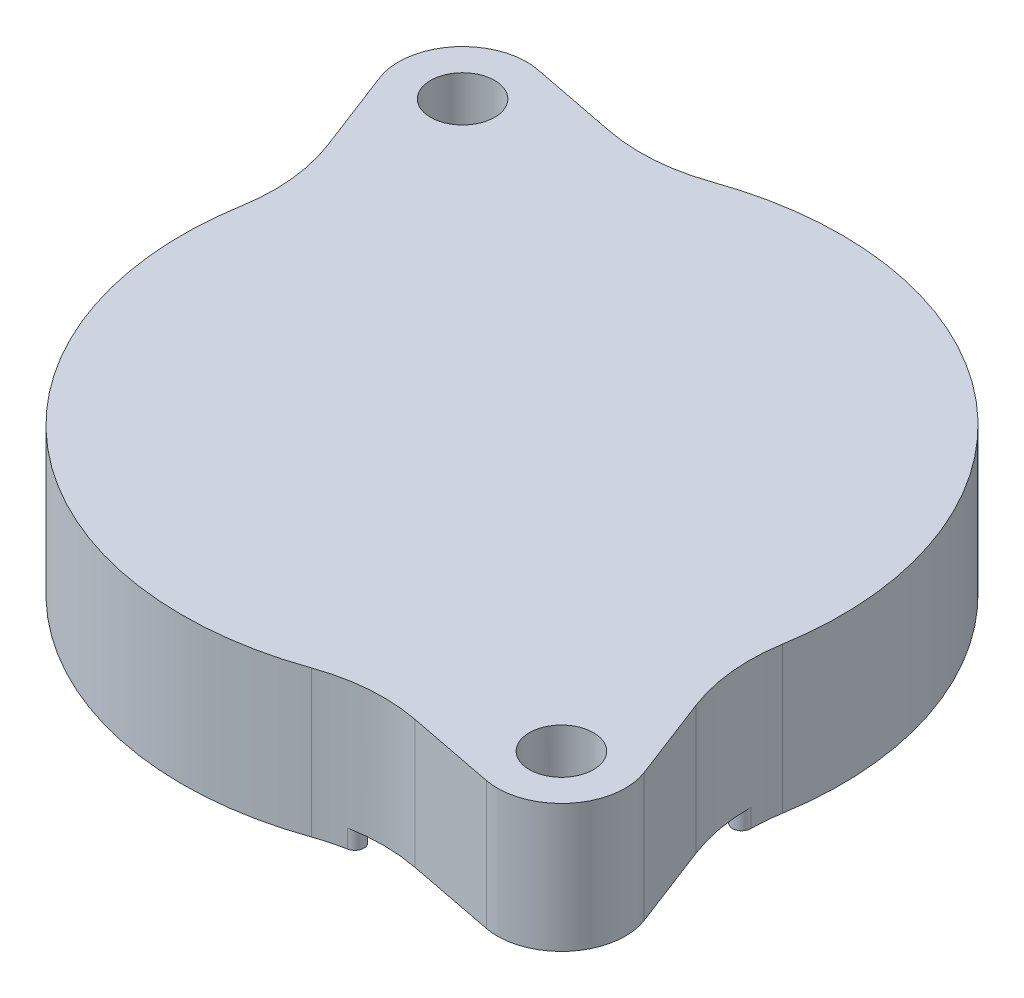
ISO-10303-21;
HEADER;
FILE_DESCRIPTION(('STEP AP214'),'2;1');
FILE_NAME('part.step','',(''),(''),'','','');
FILE_SCHEMA(('AUTOMOTIVE_DESIGN { 1 0 10303 214 1 1 1 1 }'));
ENDSEC;
DATA;
#1=APPLICATION_CONTEXT('core data for automotive mechanical design processes');
#2=APPLICATION_PROTOCOL_DEFINITION('international standard','automotive_design',2000,#1);
#3=PRODUCT_CONTEXT('',#1,'mechanical');
#4=PRODUCT('Part','Part','',(#3));
#5=PRODUCT_RELATED_PRODUCT_CATEGORY('part','',(#4));
#6=PRODUCT_DEFINITION_FORMATION('','',#4);
#7=PRODUCT_DEFINITION_CONTEXT('part definition',#1,'design');
#8=PRODUCT_DEFINITION('design','',#6,#7);
#9=PRODUCT_DEFINITION_SHAPE('','',#8);
#10=(LENGTH_UNIT() NAMED_UNIT(*) SI_UNIT(.MILLI.,.METRE.));
#11=(NAMED_UNIT(*) PLANE_ANGLE_UNIT() SI_UNIT($,.RADIAN.));
#12=(NAMED_UNIT(*) SI_UNIT($,.STERADIAN.) SOLID_ANGLE_UNIT());
#13=UNCERTAINTY_MEASURE_WITH_UNIT(LENGTH_MEASURE(1.E-05),#10,'distance_accuracy_value','');
#14=(GEOMETRIC_REPRESENTATION_CONTEXT(3) GLOBAL_UNCERTAINTY_ASSIGNED_CONTEXT((#13)) GLOBAL_UNIT_ASSIGNED_CONTEXT((#10,
#11,#12)) REPRESENTATION_CONTEXT('',''));
#15=CARTESIAN_POINT('',(0.,0.,0.));
#16=DIRECTION('',(0.,0.,1.));
#17=DIRECTION('',(1.,0.,0.));
#18=AXIS2_PLACEMENT_3D('',#15,#16,#17);
#19=CARTESIAN_POINT('',(9.36197194042168,0.5,26.3885104048477));
#20=DIRECTION('',(0.,1.,0.));
#21=DIRECTION('',(0.,0.,1.));
#22=AXIS2_PLACEMENT_3D('',#19,#20,#21);
#23=PLANE('',#22);
#24=CARTESIAN_POINT('',(-16.7763733043056,0.5,-14.0770486521352));
#25=DIRECTION('',(0.,1.,0.));
#26=DIRECTION('',(0.,0.,1.));
#27=AXIS2_PLACEMENT_3D('',#24,#25,#26);
#28=CIRCLE('',#27,1.75);
#29=CARTESIAN_POINT('',(-16.7763733043056,0.5,-12.3270486521352));
#30=VERTEX_POINT('',#29);
#31=EDGE_CURVE('E603',#30,#30,#28,.T.);
#32=ORIENTED_EDGE('',*,*,#31,.T.);
#33=EDGE_LOOP('',(#32));
#34=FACE_BOUND('',#33,.T.);
#35=CARTESIAN_POINT('',(16.7763733043056,0.5,14.0770486521352));
#36=DIRECTION('',(0.,1.,0.));
#37=DIRECTION('',(0.,0.,1.));
#38=AXIS2_PLACEMENT_3D('',#35,#36,#37);
#39=CIRCLE('',#38,1.75);
#40=CARTESIAN_POINT('',(16.7763733043056,0.5,15.8270486521352));
#41=VERTEX_POINT('',#40);
#42=EDGE_CURVE('E460',#41,#41,#39,.T.);
#43=ORIENTED_EDGE('',*,*,#42,.T.);
#44=EDGE_LOOP('',(#43));
#45=FACE_BOUND('',#44,.T.);
#46=CARTESIAN_POINT('',(-17.1135194082719,0.5,-4.56939315363405));
#47=DIRECTION('',(0.,-1.,0.));
#48=DIRECTION('',(0.,0.,1.));
#49=AXIS2_PLACEMENT_3D('',#46,#47,#48);
#50=CIRCLE('',#49,0.500000000000006);
#51=CARTESIAN_POINT('',(-17.6135089128285,0.5,-4.57263280380687));
#52=VERTEX_POINT('',#51);
#53=CARTESIAN_POINT('',(-16.7921256034286,0.5,-4.95241537519354));
#54=VERTEX_POINT('',#53);
#55=EDGE_CURVE('E458',#52,#54,#50,.T.);
#56=ORIENTED_EDGE('',*,*,#55,.F.);
#57=CARTESIAN_POINT('',(-27.6132990039605,0.5,-4.63742580726334));
#58=DIRECTION('',(0.,1.,0.));
#59=DIRECTION('',(0.,0.,1.));
#60=AXIS2_PLACEMENT_3D('',#57,#58,#59);
#61=CIRCLE('',#60,9.99999999999999);
#62=CARTESIAN_POINT('',(-18.2774947389885,0.5,-8.2211053027163));
#63=VERTEX_POINT('',#62);
#64=EDGE_CURVE('E243',#52,#63,#61,.T.);
#65=ORIENTED_EDGE('',*,*,#64,.T.);
#66=DIRECTION('',(-0.358367949545296,0.,-0.933580426497204));
#67=VECTOR('',#66,1.);
#68=CARTESIAN_POINT('',(-18.2774947389885,0.5,-8.2211053027163));
#69=LINE('',#68,#67);
#70=CARTESIAN_POINT('',(-20.0439047970459,0.5,-12.8227608287267));
#71=VERTEX_POINT('',#70);
#72=EDGE_CURVE('E369',#63,#71,#69,.T.);
#73=ORIENTED_EDGE('',*,*,#72,.T.);
#74=CARTESIAN_POINT('',(-16.7763733043056,0.5,-14.0770486521352));
#75=DIRECTION('',(0.,-1.,0.));
#76=DIRECTION('',(0.,0.,-1.));
#77=AXIS2_PLACEMENT_3D('',#74,#75,#76);
#78=CIRCLE('',#77,3.5);
#79=CARTESIAN_POINT('',(-16.1085418204878,0.5,-17.512743794202));
#80=VERTEX_POINT('',#79);
#81=EDGE_CURVE('E372',#71,#80,#78,.T.);
#82=ORIENTED_EDGE('',*,*,#81,.T.);
#83=DIRECTION('',(0.981627183447665,0.,0.190808995376539));
#84=VECTOR('',#83,1.);
#85=CARTESIAN_POINT('',(-16.1085418204878,0.5,-17.512743794202));
#86=LINE('',#85,#84);
#87=CARTESIAN_POINT('',(-11.2700618941871,0.5,-16.5722385703711));
#88=VERTEX_POINT('',#87);
#89=EDGE_CURVE('E375',#80,#88,#86,.T.);
#90=ORIENTED_EDGE('',*,*,#89,.T.);
#91=CARTESIAN_POINT('',(-9.36197194042165,0.5,-26.3885104048478));
#92=DIRECTION('',(0.,1.,0.));
#93=DIRECTION('',(0.,0.,1.));
#94=AXIS2_PLACEMENT_3D('',#91,#92,#93);
#95=CIRCLE('',#94,10.);
#96=CARTESIAN_POINT('',(-7.56171796189986,0.5,-16.551890781582));
#97=VERTEX_POINT('',#96);
#98=EDGE_CURVE('E378',#88,#97,#95,.T.);
#99=ORIENTED_EDGE('',*,*,#98,.T.);
#100=CARTESIAN_POINT('',(-7.47170526297377,0.5,-16.0600598004187));
#101=DIRECTION('',(0.,-1.,0.));
#102=DIRECTION('',(0.,0.,1.));
#103=AXIS2_PLACEMENT_3D('',#100,#101,#102);
#104=CIRCLE('',#103,0.500000000000007);
#105=CARTESIAN_POINT('',(-7.79309906781705,0.5,-15.6770375788592));
#106=VERTEX_POINT('',#105);
#107=EDGE_CURVE('E257',#106,#97,#104,.T.);
#108=ORIENTED_EDGE('',*,*,#107,.F.);
#109=DIRECTION('',(-0.766044443118979,0.,-0.642787609686538));
#110=VECTOR('',#109,1.);
#111=CARTESIAN_POINT('',(-7.79309906781705,0.5,-15.6770375788592));
#112=LINE('',#111,#110);
#113=CARTESIAN_POINT('',(-7.40043419447198,0.5,-15.3475526284591));
#114=VERTEX_POINT('',#113);
#115=EDGE_CURVE('E288',#114,#106,#112,.T.);
#116=ORIENTED_EDGE('',*,*,#115,.F.);
#117=CARTESIAN_POINT('',(-7.07904038962871,0.5,-15.7305748500186));
#118=DIRECTION('',(0.,-1.,0.));
#119=DIRECTION('',(0.,0.,1.));
#120=AXIS2_PLACEMENT_3D('',#117,#118,#119);
#121=CIRCLE('',#120,0.500000000000004);
#122=CARTESIAN_POINT('',(-6.87385126062866,0.5,-15.2746171531429));
#123=VERTEX_POINT('',#122);
#124=EDGE_CURVE('E285',#123,#114,#121,.T.);
#125=ORIENTED_EDGE('',*,*,#124,.F.);
#126=CARTESIAN_POINT('',(0.,0.5,0.));
#127=DIRECTION('',(0.,1.,0.));
#128=DIRECTION('',(0.,0.,-1.));
#129=AXIS2_PLACEMENT_3D('',#126,#127,#128);
#130=CIRCLE('',#129,16.750037621699);
#131=CARTESIAN_POINT('',(16.2361931416701,0.5,4.11701258131654));
#132=VERTEX_POINT('',#131);
#133=EDGE_CURVE('E282',#132,#123,#130,.T.);
#134=ORIENTED_EDGE('',*,*,#133,.F.);
#135=CARTESIAN_POINT('',(16.7208545349268,0.5,4.23990820323392));
#136=DIRECTION('',(0.,-1.,0.));
#137=DIRECTION('',(0.,0.,1.));
#138=AXIS2_PLACEMENT_3D('',#135,#136,#137);
#139=CIRCLE('',#138,0.500000000000004);
#140=CARTESIAN_POINT('',(16.3994607300835,0.5,4.62293042479341));
#141=VERTEX_POINT('',#140);
#142=EDGE_CURVE('E279',#141,#132,#139,.T.);
#143=ORIENTED_EDGE('',*,*,#142,.F.);
#144=DIRECTION('',(-0.766044443118984,0.,-0.642787609686532));
#145=VECTOR('',#144,1.);
#146=CARTESIAN_POINT('',(16.3994607300835,0.5,4.62293042479341));
#147=LINE('',#146,#145);
#148=CARTESIAN_POINT('',(16.7921256034286,0.5,4.95241537519352));
#149=VERTEX_POINT('',#148);
#150=EDGE_CURVE('E247',#149,#141,#147,.T.);
#151=ORIENTED_EDGE('',*,*,#150,.F.);
#152=CARTESIAN_POINT('',(17.1135194082719,0.5,4.56939315363402));
#153=DIRECTION('',(0.,-1.,0.));
#154=DIRECTION('',(0.,0.,1.));
#155=AXIS2_PLACEMENT_3D('',#152,#153,#154);
#156=CIRCLE('',#155,0.500000000000004);
#157=CARTESIAN_POINT('',(17.6135089128285,0.5,4.57263280380685));
#158=VERTEX_POINT('',#157);
#159=EDGE_CURVE('E244',#158,#149,#156,.T.);
#160=ORIENTED_EDGE('',*,*,#159,.F.);
#161=CARTESIAN_POINT('',(27.6132990039605,0.5,4.63742580726333));
#162=DIRECTION('',(0.,1.,0.));
#163=DIRECTION('',(0.,0.,1.));
#164=AXIS2_PLACEMENT_3D('',#161,#162,#163);
#165=CIRCLE('',#164,10.);
#166=CARTESIAN_POINT('',(18.2774947389885,0.5,8.22110530271631));
#167=VERTEX_POINT('',#166);
#168=EDGE_CURVE('E386',#158,#167,#165,.T.);
#169=ORIENTED_EDGE('',*,*,#168,.T.);
#170=DIRECTION('',(0.358367949545295,0.,0.933580426497204));
#171=VECTOR('',#170,1.);
#172=CARTESIAN_POINT('',(18.2774947389885,0.5,8.22110530271631));
#173=LINE('',#172,#171);
#174=CARTESIAN_POINT('',(20.0439047970458,0.5,12.8227608287267));
#175=VERTEX_POINT('',#174);
#176=EDGE_CURVE('E388',#167,#175,#173,.T.);
#177=ORIENTED_EDGE('',*,*,#176,.T.);
#178=CARTESIAN_POINT('',(16.7763733043056,0.5,14.0770486521352));
#179=DIRECTION('',(0.,-1.,0.));
#180=DIRECTION('',(0.,0.,-1.));
#181=AXIS2_PLACEMENT_3D('',#178,#179,#180);
#182=CIRCLE('',#181,3.49999999999999);
#183=CARTESIAN_POINT('',(16.1085418204877,0.5,17.512743794202));
#184=VERTEX_POINT('',#183);
#185=EDGE_CURVE('E512',#175,#184,#182,.T.);
#186=ORIENTED_EDGE('',*,*,#185,.T.);
#187=DIRECTION('',(-0.981627183447665,0.,-0.19080899537654));
#188=VECTOR('',#187,1.);
#189=CARTESIAN_POINT('',(16.1085418204877,0.5,17.512743794202));
#190=LINE('',#189,#188);
#191=CARTESIAN_POINT('',(11.2700618941871,0.5,16.5722385703711));
#192=VERTEX_POINT('',#191);
#193=EDGE_CURVE('E332',#184,#192,#190,.T.);
#194=ORIENTED_EDGE('',*,*,#193,.T.);
#195=CARTESIAN_POINT('',(9.36197194042168,0.5,26.3885104048477));
#196=DIRECTION('',(0.,1.,0.));
#197=DIRECTION('',(0.,0.,1.));
#198=AXIS2_PLACEMENT_3D('',#195,#196,#197);
#199=CIRCLE('',#198,9.99999999999999);
#200=CARTESIAN_POINT('',(7.56171796189986,0.5,16.551890781582));
#201=VERTEX_POINT('',#200);
#202=EDGE_CURVE('E366',#192,#201,#199,.T.);
#203=ORIENTED_EDGE('',*,*,#202,.T.);
#204=CARTESIAN_POINT('',(7.47170526297377,0.5,16.0600598004187));
#205=DIRECTION('',(0.,-1.,0.));
#206=DIRECTION('',(0.,0.,1.));
#207=AXIS2_PLACEMENT_3D('',#204,#205,#206);
#208=CIRCLE('',#207,0.500000000000005);
#209=CARTESIAN_POINT('',(7.79309906781704,0.5,15.6770375788592));
#210=VERTEX_POINT('',#209);
#211=EDGE_CURVE('E238',#210,#201,#208,.T.);
#212=ORIENTED_EDGE('',*,*,#211,.F.);
#213=DIRECTION('',(0.766044443118974,0.,0.642787609686544));
#214=VECTOR('',#213,1.);
#215=CARTESIAN_POINT('',(7.79309906781704,0.5,15.6770375788592));
#216=LINE('',#215,#214);
#217=CARTESIAN_POINT('',(7.40043419447198,0.5,15.3475526284591));
#218=VERTEX_POINT('',#217);
#219=EDGE_CURVE('E469',#218,#210,#216,.T.);
#220=ORIENTED_EDGE('',*,*,#219,.F.);
#221=CARTESIAN_POINT('',(7.07904038962871,0.5,15.7305748500186));
#222=DIRECTION('',(0.,-1.,0.));
#223=DIRECTION('',(0.,0.,1.));
#224=AXIS2_PLACEMENT_3D('',#221,#222,#223);
#225=CIRCLE('',#224,0.500000000000004);
#226=CARTESIAN_POINT('',(6.87385126062867,0.5,15.2746171531429));
#227=VERTEX_POINT('',#226);
#228=EDGE_CURVE('E466',#227,#218,#225,.T.);
#229=ORIENTED_EDGE('',*,*,#228,.F.);
#230=CARTESIAN_POINT('',(0.,0.5,0.));
#231=DIRECTION('',(0.,1.,0.));
#232=DIRECTION('',(0.,0.,-1.));
#233=AXIS2_PLACEMENT_3D('',#230,#231,#232);
#234=CIRCLE('',#233,16.750037621699);
#235=CARTESIAN_POINT('',(-16.2361931416701,0.5,-4.11701258131654));
#236=VERTEX_POINT('',#235);
#237=EDGE_CURVE('E463',#236,#227,#234,.T.);
#238=ORIENTED_EDGE('',*,*,#237,.F.);
#239=CARTESIAN_POINT('',(-16.7208545349268,0.5,-4.23990820323392));
#240=DIRECTION('',(0.,-1.,0.));
#241=DIRECTION('',(0.,0.,1.));
#242=AXIS2_PLACEMENT_3D('',#239,#240,#241);
#243=CIRCLE('',#242,0.500000000000007);
#244=CARTESIAN_POINT('',(-16.3994607300835,0.5,-4.62293042479342));
#245=VERTEX_POINT('',#244);
#246=EDGE_CURVE('E57',#245,#236,#243,.T.);
#247=ORIENTED_EDGE('',*,*,#246,.F.);
#248=DIRECTION('',(0.766044443118981,0.,0.642787609686535));
#249=VECTOR('',#248,1.);
#250=CARTESIAN_POINT('',(-16.3994607300835,0.5,-4.62293042479342));
#251=LINE('',#250,#249);
#252=EDGE_CURVE('E52',#54,#245,#251,.T.);
#253=ORIENTED_EDGE('',*,*,#252,.F.);
#254=EDGE_LOOP('',(#56,#65,#73,#82,#90,#99,#108,#116,#125,#134,#143,#151,#160,#169,#177,#186,
#194,#203,#212,#220,#229,#238,#247,#253));
#255=FACE_BOUND('',#254,.T.);
#256=ADVANCED_FACE('F35',(#34,#45,#255),#23,.F.);
#257=CARTESIAN_POINT('',(9.36197194042168,7.5,26.3885104048477));
#258=DIRECTION('',(0.,-1.,0.));
#259=DIRECTION('',(0.,0.,-1.));
#260=AXIS2_PLACEMENT_3D('',#257,#258,#259);
#261=CYLINDRICAL_SURFACE('',#260,9.99999999999999);
#262=ORIENTED_EDGE('',*,*,#202,.F.);
#263=DIRECTION('',(0.,-1.,0.));
#264=VECTOR('',#263,1.);
#265=CARTESIAN_POINT('',(11.2700618941871,7.5,16.5722385703711));
#266=LINE('',#265,#264);
#267=CARTESIAN_POINT('',(11.2700618941871,7.5,16.5722385703711));
#268=VERTEX_POINT('',#267);
#269=EDGE_CURVE('E11',#268,#192,#266,.T.);
#270=ORIENTED_EDGE('',*,*,#269,.F.);
#271=CARTESIAN_POINT('',(9.36197194042168,7.5,26.3885104048477));
#272=DIRECTION('',(0.,1.,0.));
#273=DIRECTION('',(0.,0.,1.));
#274=AXIS2_PLACEMENT_3D('',#271,#272,#273);
#275=CIRCLE('',#274,9.99999999999999);
#276=CARTESIAN_POINT('',(6.01841053312822,7.5,16.9640424031164));
#277=VERTEX_POINT('',#276);
#278=EDGE_CURVE('E328',#268,#277,#275,.T.);
#279=ORIENTED_EDGE('',*,*,#278,.T.);
#280=DIRECTION('',(0.,-1.,0.));
#281=VECTOR('',#280,1.);
#282=CARTESIAN_POINT('',(6.01841053312822,7.5,16.9640424031164));
#283=LINE('',#282,#281);
#284=CARTESIAN_POINT('',(6.01841053312823,-0.5,16.9640424031164));
#285=VERTEX_POINT('',#284);
#286=EDGE_CURVE('E365',#277,#285,#283,.T.);
#287=ORIENTED_EDGE('',*,*,#286,.T.);
#288=CARTESIAN_POINT('',(9.36197194042168,-0.5,26.3885104048477));
#289=DIRECTION('',(0.,1.,0.));
#290=DIRECTION('',(0.,0.,-1.));
#291=AXIS2_PLACEMENT_3D('',#288,#289,#290);
#292=CIRCLE('',#291,9.99999999999999);
#293=CARTESIAN_POINT('',(7.56171796189986,-0.5,16.551890781582));
#294=VERTEX_POINT('',#293);
#295=EDGE_CURVE('E444',#294,#285,#292,.T.);
#296=ORIENTED_EDGE('',*,*,#295,.F.);
#297=DIRECTION('',(0.,1.,0.));
#298=VECTOR('',#297,1.);
#299=CARTESIAN_POINT('',(7.56171796189986,-0.5,16.551890781582));
#300=LINE('',#299,#298);
#301=EDGE_CURVE('E452',#294,#201,#300,.T.);
#302=ORIENTED_EDGE('',*,*,#301,.T.);
#303=EDGE_LOOP('',(#262,#270,#279,#287,#296,#302));
#304=FACE_BOUND('',#303,.T.);
#305=ADVANCED_FACE('F37',(#304),#261,.F.);
#306=CARTESIAN_POINT('',(16.1085418204877,7.5,17.512743794202));
#307=DIRECTION('',(-0.19080899537654,0.,0.981627183447665));
#308=DIRECTION('',(0.981627183447665,0.,0.19080899537654));
#309=AXIS2_PLACEMENT_3D('',#306,#307,#308);
#310=PLANE('',#309);
#311=ORIENTED_EDGE('',*,*,#193,.F.);
#312=DIRECTION('',(0.,-1.,0.));
#313=VECTOR('',#312,1.);
#314=CARTESIAN_POINT('',(16.1085418204877,7.5,17.512743794202));
#315=LINE('',#314,#313);
#316=CARTESIAN_POINT('',(16.1085418204877,7.5,17.512743794202));
#317=VERTEX_POINT('',#316);
#318=EDGE_CURVE('E44',#317,#184,#315,.T.);
#319=ORIENTED_EDGE('',*,*,#318,.F.);
#320=DIRECTION('',(-0.981627183447665,0.,-0.19080899537654));
#321=VECTOR('',#320,1.);
#322=CARTESIAN_POINT('',(16.1085418204877,7.5,17.512743794202));
#323=LINE('',#322,#321);
#324=EDGE_CURVE('E362',#317,#268,#323,.T.);
#325=ORIENTED_EDGE('',*,*,#324,.T.);
#326=ORIENTED_EDGE('',*,*,#269,.T.);
#327=EDGE_LOOP('',(#311,#319,#325,#326));
#328=FACE_BOUND('',#327,.T.);
#329=ADVANCED_FACE('F524',(#328),#310,.T.);
#330=CARTESIAN_POINT('',(16.7763733043056,7.5,14.0770486521352));
#331=DIRECTION('',(0.,-1.,0.));
#332=DIRECTION('',(0.,0.,-1.));
#333=AXIS2_PLACEMENT_3D('',#330,#331,#332);
#334=CYLINDRICAL_SURFACE('',#333,3.49999999999999);
#335=ORIENTED_EDGE('',*,*,#185,.F.);
#336=DIRECTION('',(0.,-1.,0.));
#337=VECTOR('',#336,1.);
#338=CARTESIAN_POINT('',(20.0439047970458,7.5,12.8227608287267));
#339=LINE('',#338,#337);
#340=CARTESIAN_POINT('',(20.0439047970458,7.5,12.8227608287267));
#341=VERTEX_POINT('',#340);
#342=EDGE_CURVE('E426',#341,#175,#339,.T.);
#343=ORIENTED_EDGE('',*,*,#342,.F.);
#344=CARTESIAN_POINT('',(16.7763733043056,7.5,14.0770486521352));
#345=DIRECTION('',(0.,-1.,0.));
#346=DIRECTION('',(0.,0.,-1.));
#347=AXIS2_PLACEMENT_3D('',#344,#345,#346);
#348=CIRCLE('',#347,3.49999999999999);
#349=EDGE_CURVE('E359',#341,#317,#348,.T.);
#350=ORIENTED_EDGE('',*,*,#349,.T.);
#351=ORIENTED_EDGE('',*,*,#318,.T.);
#352=EDGE_LOOP('',(#335,#343,#350,#351));
#353=FACE_BOUND('',#352,.T.);
#354=ADVANCED_FACE('F522',(#353),#334,.T.);
#355=CARTESIAN_POINT('',(18.2774947389885,7.5,8.22110530271631));
#356=DIRECTION('',(0.933580426497204,0.,-0.358367949545295));
#357=DIRECTION('',(-0.358367949545295,0.,-0.933580426497204));
#358=AXIS2_PLACEMENT_3D('',#355,#356,#357);
#359=PLANE('',#358);
#360=ORIENTED_EDGE('',*,*,#176,.F.);
#361=DIRECTION('',(0.,-1.,0.));
#362=VECTOR('',#361,1.);
#363=CARTESIAN_POINT('',(18.2774947389885,7.5,8.22110530271631));
#364=LINE('',#363,#362);
#365=CARTESIAN_POINT('',(18.2774947389885,7.5,8.22110530271631));
#366=VERTEX_POINT('',#365);
#367=EDGE_CURVE('E402',#366,#167,#364,.T.);
#368=ORIENTED_EDGE('',*,*,#367,.F.);
#369=DIRECTION('',(0.358367949545295,0.,0.933580426497204));
#370=VECTOR('',#369,1.);
#371=CARTESIAN_POINT('',(18.2774947389885,7.5,8.22110530271631));
#372=LINE('',#371,#370);
#373=EDGE_CURVE('E356',#366,#341,#372,.T.);
#374=ORIENTED_EDGE('',*,*,#373,.T.);
#375=ORIENTED_EDGE('',*,*,#342,.T.);
#376=EDGE_LOOP('',(#360,#368,#374,#375));
#377=FACE_BOUND('',#376,.T.);
#378=ADVANCED_FACE('F518',(#377),#359,.T.);
#379=CARTESIAN_POINT('',(27.6132990039605,7.5,4.63742580726333));
#380=DIRECTION('',(0.,-1.,0.));
#381=DIRECTION('',(0.,0.,-1.));
#382=AXIS2_PLACEMENT_3D('',#379,#380,#381);
#383=CYLINDRICAL_SURFACE('',#382,10.);
#384=ORIENTED_EDGE('',*,*,#168,.F.);
#385=DIRECTION('',(0.,1.,0.));
#386=VECTOR('',#385,1.);
#387=CARTESIAN_POINT('',(17.6135089128285,-0.5,4.57263280380685));
#388=LINE('',#387,#386);
#389=CARTESIAN_POINT('',(17.6135089128285,-0.5,4.57263280380685));
#390=VERTEX_POINT('',#389);
#391=EDGE_CURVE('E327',#390,#158,#388,.T.);
#392=ORIENTED_EDGE('',*,*,#391,.F.);
#393=CARTESIAN_POINT('',(27.6132990039605,-0.5,4.63742580726333));
#394=DIRECTION('',(0.,1.,0.));
#395=DIRECTION('',(0.,0.,-1.));
#396=AXIS2_PLACEMENT_3D('',#393,#394,#395);
#397=CIRCLE('',#396,10.);
#398=CARTESIAN_POINT('',(17.7514065025461,-0.5,2.98120230466929));
#399=VERTEX_POINT('',#398);
#400=EDGE_CURVE('E260',#399,#390,#397,.T.);
#401=ORIENTED_EDGE('',*,*,#400,.F.);
#402=DIRECTION('',(0.,-1.,0.));
#403=VECTOR('',#402,1.);
#404=CARTESIAN_POINT('',(17.7514065025461,7.5,2.98120230466927));
#405=LINE('',#404,#403);
#406=CARTESIAN_POINT('',(17.7514065025461,7.5,2.98120230466927));
#407=VERTEX_POINT('',#406);
#408=EDGE_CURVE('E423',#407,#399,#405,.T.);
#409=ORIENTED_EDGE('',*,*,#408,.F.);
#410=CARTESIAN_POINT('',(27.6132990039605,7.5,4.63742580726333));
#411=DIRECTION('',(0.,1.,0.));
#412=DIRECTION('',(0.,0.,1.));
#413=AXIS2_PLACEMENT_3D('',#410,#411,#412);
#414=CIRCLE('',#413,10.);
#415=EDGE_CURVE('E353',#407,#366,#414,.T.);
#416=ORIENTED_EDGE('',*,*,#415,.T.);
#417=ORIENTED_EDGE('',*,*,#367,.T.);
#418=EDGE_LOOP('',(#384,#392,#401,#409,#416,#417));
#419=FACE_BOUND('',#418,.T.);
#420=ADVANCED_FACE('F400',(#419),#383,.F.);
#421=CARTESIAN_POINT('',(0.,7.5,0.));
#422=DIRECTION('',(0.,-1.,0.));
#423=DIRECTION('',(0.,0.,-1.));
#424=AXIS2_PLACEMENT_3D('',#421,#422,#423);
#425=CYLINDRICAL_SURFACE('',#424,18.);
#426=ORIENTED_EDGE('',*,*,#408,.T.);
#427=CARTESIAN_POINT('',(0.,-0.5,0.));
#428=DIRECTION('',(0.,-1.,0.));
#429=DIRECTION('',(0.,0.,1.));
#430=AXIS2_PLACEMENT_3D('',#427,#428,#429);
#431=CIRCLE('',#430,18.);
#432=CARTESIAN_POINT('',(-6.0184105331282,-0.5,-16.9640424031164));
#433=VERTEX_POINT('',#432);
#434=EDGE_CURVE('E256',#433,#399,#431,.T.);
#435=ORIENTED_EDGE('',*,*,#434,.F.);
#436=DIRECTION('',(0.,-1.,0.));
#437=VECTOR('',#436,1.);
#438=CARTESIAN_POINT('',(-6.01841053312822,7.5,-16.9640424031164));
#439=LINE('',#438,#437);
#440=CARTESIAN_POINT('',(-6.01841053312822,7.5,-16.9640424031164));
#441=VERTEX_POINT('',#440);
#442=EDGE_CURVE('E421',#441,#433,#439,.T.);
#443=ORIENTED_EDGE('',*,*,#442,.F.);
#444=CARTESIAN_POINT('',(0.,7.5,0.));
#445=DIRECTION('',(0.,-1.,0.));
#446=DIRECTION('',(0.,0.,-1.));
#447=AXIS2_PLACEMENT_3D('',#444,#445,#446);
#448=CIRCLE('',#447,18.);
#449=EDGE_CURVE('E350',#441,#407,#448,.T.);
#450=ORIENTED_EDGE('',*,*,#449,.T.);
#451=EDGE_LOOP('',(#426,#435,#443,#450));
#452=FACE_BOUND('',#451,.T.);
#453=ADVANCED_FACE('F420',(#452),#425,.T.);
#454=CARTESIAN_POINT('',(-9.36197194042165,7.5,-26.3885104048478));
#455=DIRECTION('',(0.,-1.,0.));
#456=DIRECTION('',(0.,0.,-1.));
#457=AXIS2_PLACEMENT_3D('',#454,#455,#456);
#458=CYLINDRICAL_SURFACE('',#457,10.);
#459=ORIENTED_EDGE('',*,*,#98,.F.);
#460=DIRECTION('',(0.,-1.,0.));
#461=VECTOR('',#460,1.);
#462=CARTESIAN_POINT('',(-11.2700618941871,7.5,-16.5722385703711));
#463=LINE('',#462,#461);
#464=CARTESIAN_POINT('',(-11.2700618941871,7.5,-16.5722385703711));
#465=VERTEX_POINT('',#464);
#466=EDGE_CURVE('E428',#465,#88,#463,.T.);
#467=ORIENTED_EDGE('',*,*,#466,.F.);
#468=CARTESIAN_POINT('',(-9.36197194042165,7.5,-26.3885104048478));
#469=DIRECTION('',(0.,1.,0.));
#470=DIRECTION('',(0.,0.,1.));
#471=AXIS2_PLACEMENT_3D('',#468,#469,#470);
#472=CIRCLE('',#471,10.);
#473=EDGE_CURVE('E347',#465,#441,#472,.T.);
#474=ORIENTED_EDGE('',*,*,#473,.T.);
#475=ORIENTED_EDGE('',*,*,#442,.T.);
#476=CARTESIAN_POINT('',(-9.36197194042165,-0.5,-26.3885104048478));
#477=DIRECTION('',(0.,1.,0.));
#478=DIRECTION('',(0.,0.,-1.));
#479=AXIS2_PLACEMENT_3D('',#476,#477,#478);
#480=CIRCLE('',#479,10.);
#481=CARTESIAN_POINT('',(-7.56171796189987,-0.5,-16.551890781582));
#482=VERTEX_POINT('',#481);
#483=EDGE_CURVE('E253',#482,#433,#480,.T.);
#484=ORIENTED_EDGE('',*,*,#483,.F.);
#485=DIRECTION('',(0.,1.,0.));
#486=VECTOR('',#485,1.);
#487=CARTESIAN_POINT('',(-7.56171796189987,-0.5,-16.551890781582));
#488=LINE('',#487,#486);
#489=EDGE_CURVE('E276',#482,#97,#488,.T.);
#490=ORIENTED_EDGE('',*,*,#489,.T.);
#491=EDGE_LOOP('',(#459,#467,#474,#475,#484,#490));
#492=FACE_BOUND('',#491,.T.);
#493=ADVANCED_FACE('F541',(#492),#458,.F.);
#494=CARTESIAN_POINT('',(-16.1085418204878,7.5,-17.512743794202));
#495=DIRECTION('',(0.190808995376539,0.,-0.981627183447665));
#496=DIRECTION('',(-0.981627183447665,0.,-0.190808995376539));
#497=AXIS2_PLACEMENT_3D('',#494,#495,#496);
#498=PLANE('',#497);
#499=ORIENTED_EDGE('',*,*,#89,.F.);
#500=DIRECTION('',(0.,-1.,0.));
#501=VECTOR('',#500,1.);
#502=CARTESIAN_POINT('',(-16.1085418204878,7.5,-17.512743794202));
#503=LINE('',#502,#501);
#504=CARTESIAN_POINT('',(-16.1085418204878,7.5,-17.512743794202));
#505=VERTEX_POINT('',#504);
#506=EDGE_CURVE('E433',#505,#80,#503,.T.);
#507=ORIENTED_EDGE('',*,*,#506,.F.);
#508=DIRECTION('',(0.981627183447665,0.,0.190808995376539));
#509=VECTOR('',#508,1.);
#510=CARTESIAN_POINT('',(-16.1085418204878,7.5,-17.512743794202));
#511=LINE('',#510,#509);
#512=EDGE_CURVE('E344',#505,#465,#511,.T.);
#513=ORIENTED_EDGE('',*,*,#512,.T.);
#514=ORIENTED_EDGE('',*,*,#466,.T.);
#515=EDGE_LOOP('',(#499,#507,#513,#514));
#516=FACE_BOUND('',#515,.T.);
#517=ADVANCED_FACE('F539',(#516),#498,.T.);
#518=CARTESIAN_POINT('',(-16.7763733043056,7.5,-14.0770486521352));
#519=DIRECTION('',(0.,-1.,0.));
#520=DIRECTION('',(0.,0.,-1.));
#521=AXIS2_PLACEMENT_3D('',#518,#519,#520);
#522=CYLINDRICAL_SURFACE('',#521,3.5);
#523=ORIENTED_EDGE('',*,*,#81,.F.);
#524=DIRECTION('',(0.,-1.,0.));
#525=VECTOR('',#524,1.);
#526=CARTESIAN_POINT('',(-20.0439047970459,7.5,-12.8227608287267));
#527=LINE('',#526,#525);
#528=CARTESIAN_POINT('',(-20.0439047970459,7.5,-12.8227608287267));
#529=VERTEX_POINT('',#528);
#530=EDGE_CURVE('E435',#529,#71,#527,.T.);
#531=ORIENTED_EDGE('',*,*,#530,.F.);
#532=CARTESIAN_POINT('',(-16.7763733043056,7.5,-14.0770486521352));
#533=DIRECTION('',(0.,-1.,0.));
#534=DIRECTION('',(0.,0.,-1.));
#535=AXIS2_PLACEMENT_3D('',#532,#533,#534);
#536=CIRCLE('',#535,3.5);
#537=EDGE_CURVE('E341',#529,#505,#536,.T.);
#538=ORIENTED_EDGE('',*,*,#537,.T.);
#539=ORIENTED_EDGE('',*,*,#506,.T.);
#540=EDGE_LOOP('',(#523,#531,#538,#539));
#541=FACE_BOUND('',#540,.T.);
#542=ADVANCED_FACE('F536',(#541),#522,.T.);
#543=CARTESIAN_POINT('',(-18.2774947389885,7.5,-8.2211053027163));
#544=DIRECTION('',(-0.933580426497204,0.,0.358367949545296));
#545=DIRECTION('',(0.358367949545296,0.,0.933580426497204));
#546=AXIS2_PLACEMENT_3D('',#543,#544,#545);
#547=PLANE('',#546);
#548=ORIENTED_EDGE('',*,*,#72,.F.);
#549=DIRECTION('',(0.,-1.,0.));
#550=VECTOR('',#549,1.);
#551=CARTESIAN_POINT('',(-18.2774947389885,7.5,-8.2211053027163));
#552=LINE('',#551,#550);
#553=CARTESIAN_POINT('',(-18.2774947389885,7.5,-8.2211053027163));
#554=VERTEX_POINT('',#553);
#555=EDGE_CURVE('E437',#554,#63,#552,.T.);
#556=ORIENTED_EDGE('',*,*,#555,.F.);
#557=DIRECTION('',(-0.358367949545296,0.,-0.933580426497204));
#558=VECTOR('',#557,1.);
#559=CARTESIAN_POINT('',(-18.2774947389885,7.5,-8.2211053027163));
#560=LINE('',#559,#558);
#561=EDGE_CURVE('E338',#554,#529,#560,.T.);
#562=ORIENTED_EDGE('',*,*,#561,.T.);
#563=ORIENTED_EDGE('',*,*,#530,.T.);
#564=EDGE_LOOP('',(#548,#556,#562,#563));
#565=FACE_BOUND('',#564,.T.);
#566=ADVANCED_FACE('F532',(#565),#547,.T.);
#567=CARTESIAN_POINT('',(-27.6132990039605,7.5,-4.63742580726334));
#568=DIRECTION('',(0.,-1.,0.));
#569=DIRECTION('',(0.,0.,-1.));
#570=AXIS2_PLACEMENT_3D('',#567,#568,#569);
#571=CYLINDRICAL_SURFACE('',#570,9.99999999999999);
#572=ORIENTED_EDGE('',*,*,#64,.F.);
#573=DIRECTION('',(0.,1.,0.));
#574=VECTOR('',#573,1.);
#575=CARTESIAN_POINT('',(-17.6135089128285,-0.5,-4.57263280380688));
#576=LINE('',#575,#574);
#577=CARTESIAN_POINT('',(-17.6135089128285,-0.5,-4.57263280380688));
#578=VERTEX_POINT('',#577);
#579=EDGE_CURVE('E223',#578,#52,#576,.T.);
#580=ORIENTED_EDGE('',*,*,#579,.F.);
#581=CARTESIAN_POINT('',(-27.6132990039605,-0.5,-4.63742580726334));
#582=DIRECTION('',(0.,1.,0.));
#583=DIRECTION('',(0.,0.,-1.));
#584=AXIS2_PLACEMENT_3D('',#581,#582,#583);
#585=CIRCLE('',#584,9.99999999999999);
#586=CARTESIAN_POINT('',(-17.7514065025461,-0.5,-2.98120230466929));
#587=VERTEX_POINT('',#586);
#588=EDGE_CURVE('E229',#587,#578,#585,.T.);
#589=ORIENTED_EDGE('',*,*,#588,.F.);
#590=DIRECTION('',(0.,-1.,0.));
#591=VECTOR('',#590,1.);
#592=CARTESIAN_POINT('',(-17.7514065025461,7.5,-2.98120230466929));
#593=LINE('',#592,#591);
#594=CARTESIAN_POINT('',(-17.7514065025461,7.5,-2.98120230466929));
#595=VERTEX_POINT('',#594);
#596=EDGE_CURVE('E438',#595,#587,#593,.T.);
#597=ORIENTED_EDGE('',*,*,#596,.F.);
#598=CARTESIAN_POINT('',(-27.6132990039605,7.5,-4.63742580726334));
#599=DIRECTION('',(0.,1.,0.));
#600=DIRECTION('',(0.,0.,1.));
#601=AXIS2_PLACEMENT_3D('',#598,#599,#600);
#602=CIRCLE('',#601,9.99999999999999);
#603=EDGE_CURVE('E335',#595,#554,#602,.T.);
#604=ORIENTED_EDGE('',*,*,#603,.T.);
#605=ORIENTED_EDGE('',*,*,#555,.T.);
#606=EDGE_LOOP('',(#572,#580,#589,#597,#604,#605));
#607=FACE_BOUND('',#606,.T.);
#608=ADVANCED_FACE('F241',(#607),#571,.F.);
#609=CARTESIAN_POINT('',(0.,7.5,0.));
#610=DIRECTION('',(0.,-1.,0.));
#611=DIRECTION('',(0.,0.,-1.));
#612=AXIS2_PLACEMENT_3D('',#609,#610,#611);
#613=CYLINDRICAL_SURFACE('',#612,18.);
#614=ORIENTED_EDGE('',*,*,#596,.T.);
#615=CARTESIAN_POINT('',(0.,-0.5,0.));
#616=DIRECTION('',(0.,-1.,0.));
#617=DIRECTION('',(0.,0.,1.));
#618=AXIS2_PLACEMENT_3D('',#615,#616,#617);
#619=CIRCLE('',#618,18.);
#620=EDGE_CURVE('E236',#285,#587,#619,.T.);
#621=ORIENTED_EDGE('',*,*,#620,.F.);
#622=ORIENTED_EDGE('',*,*,#286,.F.);
#623=CARTESIAN_POINT('',(0.,7.5,0.));
#624=DIRECTION('',(0.,-1.,0.));
#625=DIRECTION('',(0.,0.,-1.));
#626=AXIS2_PLACEMENT_3D('',#623,#624,#625);
#627=CIRCLE('',#626,18.);
#628=EDGE_CURVE('E331',#277,#595,#627,.T.);
#629=ORIENTED_EDGE('',*,*,#628,.T.);
#630=EDGE_LOOP('',(#614,#621,#622,#629));
#631=FACE_BOUND('',#630,.T.);
#632=ADVANCED_FACE('F451',(#631),#613,.T.);
#633=CARTESIAN_POINT('',(9.36197194042168,7.5,26.3885104048477));
#634=DIRECTION('',(0.,1.,0.));
#635=DIRECTION('',(0.,0.,1.));
#636=AXIS2_PLACEMENT_3D('',#633,#634,#635);
#637=PLANE('',#636);
#638=CARTESIAN_POINT('',(-16.7763733043056,7.5,-14.0770486521352));
#639=DIRECTION('',(0.,1.,0.));
#640=DIRECTION('',(0.,0.,1.));
#641=AXIS2_PLACEMENT_3D('',#638,#639,#640);
#642=CIRCLE('',#641,1.75);
#643=CARTESIAN_POINT('',(-16.7763733043056,7.5,-12.3270486521352));
#644=VERTEX_POINT('',#643);
#645=EDGE_CURVE('E598',#644,#644,#642,.T.);
#646=ORIENTED_EDGE('',*,*,#645,.F.);
#647=EDGE_LOOP('',(#646));
#648=FACE_BOUND('',#647,.T.);
#649=CARTESIAN_POINT('',(16.7763733043056,7.5,14.0770486521352));
#650=DIRECTION('',(0.,1.,0.));
#651=DIRECTION('',(0.,0.,-1.));
#652=AXIS2_PLACEMENT_3D('',#649,#650,#651);
#653=CIRCLE('',#652,1.75);
#654=CARTESIAN_POINT('',(16.7763733043056,7.5,12.3270486521352));
#655=VERTEX_POINT('',#654);
#656=EDGE_CURVE('E601',#655,#655,#653,.T.);
#657=ORIENTED_EDGE('',*,*,#656,.F.);
#658=EDGE_LOOP('',(#657));
#659=FACE_BOUND('',#658,.T.);
#660=ORIENTED_EDGE('',*,*,#278,.F.);
#661=ORIENTED_EDGE('',*,*,#324,.F.);
#662=ORIENTED_EDGE('',*,*,#349,.F.);
#663=ORIENTED_EDGE('',*,*,#373,.F.);
#664=ORIENTED_EDGE('',*,*,#415,.F.);
#665=ORIENTED_EDGE('',*,*,#449,.F.);
#666=ORIENTED_EDGE('',*,*,#473,.F.);
#667=ORIENTED_EDGE('',*,*,#512,.F.);
#668=ORIENTED_EDGE('',*,*,#537,.F.);
#669=ORIENTED_EDGE('',*,*,#561,.F.);
#670=ORIENTED_EDGE('',*,*,#603,.F.);
#671=ORIENTED_EDGE('',*,*,#628,.F.);
#672=EDGE_LOOP('',(#660,#661,#662,#663,#664,#665,#666,#667,#668,#669,#670,#671));
#673=FACE_BOUND('',#672,.T.);
#674=ADVANCED_FACE('F526',(#648,#659,#673),#637,.T.);
#675=CARTESIAN_POINT('',(17.1135194082719,-0.5,4.56939315363402));
#676=DIRECTION('',(0.,1.,0.));
#677=DIRECTION('',(0.,0.,1.));
#678=AXIS2_PLACEMENT_3D('',#675,#676,#677);
#679=CYLINDRICAL_SURFACE('',#678,0.500000000000004);
#680=ORIENTED_EDGE('',*,*,#159,.T.);
#681=DIRECTION('',(0.,1.,0.));
#682=VECTOR('',#681,1.);
#683=CARTESIAN_POINT('',(16.7921256034286,-0.5,4.95241537519352));
#684=LINE('',#683,#682);
#685=CARTESIAN_POINT('',(16.7921256034286,-0.5,4.95241537519352));
#686=VERTEX_POINT('',#685);
#687=EDGE_CURVE('E324',#686,#149,#684,.T.);
#688=ORIENTED_EDGE('',*,*,#687,.F.);
#689=CARTESIAN_POINT('',(17.1135194082719,-0.5,4.56939315363402));
#690=DIRECTION('',(0.,-1.,0.));
#691=DIRECTION('',(0.,0.,1.));
#692=AXIS2_PLACEMENT_3D('',#689,#690,#691);
#693=CIRCLE('',#692,0.500000000000004);
#694=EDGE_CURVE('E262',#390,#686,#693,.T.);
#695=ORIENTED_EDGE('',*,*,#694,.F.);
#696=ORIENTED_EDGE('',*,*,#391,.T.);
#697=EDGE_LOOP('',(#680,#688,#695,#696));
#698=FACE_BOUND('',#697,.T.);
#699=ADVANCED_FACE('F395',(#698),#679,.T.);
#700=CARTESIAN_POINT('',(16.3994607300835,-0.5,4.62293042479341));
#701=DIRECTION('',(0.642787609686532,0.,-0.766044443118984));
#702=DIRECTION('',(-0.766044443118984,0.,-0.642787609686532));
#703=AXIS2_PLACEMENT_3D('',#700,#701,#702);
#704=PLANE('',#703);
#705=ORIENTED_EDGE('',*,*,#150,.T.);
#706=DIRECTION('',(0.,1.,0.));
#707=VECTOR('',#706,1.);
#708=CARTESIAN_POINT('',(16.3994607300835,-0.5,4.62293042479341));
#709=LINE('',#708,#707);
#710=CARTESIAN_POINT('',(16.3994607300835,-0.5,4.62293042479341));
#711=VERTEX_POINT('',#710);
#712=EDGE_CURVE('E321',#711,#141,#709,.T.);
#713=ORIENTED_EDGE('',*,*,#712,.F.);
#714=DIRECTION('',(-0.766044443118984,0.,-0.642787609686532));
#715=VECTOR('',#714,1.);
#716=CARTESIAN_POINT('',(16.3994607300835,-0.5,4.62293042479341));
#717=LINE('',#716,#715);
#718=EDGE_CURVE('E264',#686,#711,#717,.T.);
#719=ORIENTED_EDGE('',*,*,#718,.F.);
#720=ORIENTED_EDGE('',*,*,#687,.T.);
#721=EDGE_LOOP('',(#705,#713,#719,#720));
#722=FACE_BOUND('',#721,.T.);
#723=ADVANCED_FACE('F408',(#722),#704,.F.);
#724=CARTESIAN_POINT('',(16.7208545349268,-0.5,4.23990820323392));
#725=DIRECTION('',(0.,1.,0.));
#726=DIRECTION('',(0.,0.,1.));
#727=AXIS2_PLACEMENT_3D('',#724,#725,#726);
#728=CYLINDRICAL_SURFACE('',#727,0.500000000000004);
#729=ORIENTED_EDGE('',*,*,#142,.T.);
#730=DIRECTION('',(0.,1.,0.));
#731=VECTOR('',#730,1.);
#732=CARTESIAN_POINT('',(16.2361931416701,-0.5,4.11701258131654));
#733=LINE('',#732,#731);
#734=CARTESIAN_POINT('',(16.2361931416701,-0.5,4.11701258131654));
#735=VERTEX_POINT('',#734);
#736=EDGE_CURVE('E316',#735,#132,#733,.T.);
#737=ORIENTED_EDGE('',*,*,#736,.F.);
#738=CARTESIAN_POINT('',(16.7208545349268,-0.5,4.23990820323392));
#739=DIRECTION('',(0.,-1.,0.));
#740=DIRECTION('',(0.,0.,1.));
#741=AXIS2_PLACEMENT_3D('',#738,#739,#740);
#742=CIRCLE('',#741,0.500000000000004);
#743=EDGE_CURVE('E266',#711,#735,#742,.T.);
#744=ORIENTED_EDGE('',*,*,#743,.F.);
#745=ORIENTED_EDGE('',*,*,#712,.T.);
#746=EDGE_LOOP('',(#729,#737,#744,#745));
#747=FACE_BOUND('',#746,.T.);
#748=ADVANCED_FACE('F412',(#747),#728,.T.);
#749=CARTESIAN_POINT('',(0.,-0.5,0.));
#750=DIRECTION('',(0.,1.,0.));
#751=DIRECTION('',(0.,0.,1.));
#752=AXIS2_PLACEMENT_3D('',#749,#750,#751);
#753=CYLINDRICAL_SURFACE('',#752,16.750037621699);
#754=ORIENTED_EDGE('',*,*,#133,.T.);
#755=DIRECTION('',(0.,1.,0.));
#756=VECTOR('',#755,1.);
#757=CARTESIAN_POINT('',(-6.87385126062866,-0.5,-15.2746171531429));
#758=LINE('',#757,#756);
#759=CARTESIAN_POINT('',(-6.87385126062866,-0.5,-15.2746171531429));
#760=VERTEX_POINT('',#759);
#761=EDGE_CURVE('E311',#760,#123,#758,.T.);
#762=ORIENTED_EDGE('',*,*,#761,.F.);
#763=CARTESIAN_POINT('',(0.,-0.5,0.));
#764=DIRECTION('',(0.,1.,0.));
#765=DIRECTION('',(0.,0.,-1.));
#766=AXIS2_PLACEMENT_3D('',#763,#764,#765);
#767=CIRCLE('',#766,16.750037621699);
#768=EDGE_CURVE('E268',#735,#760,#767,.T.);
#769=ORIENTED_EDGE('',*,*,#768,.F.);
#770=ORIENTED_EDGE('',*,*,#736,.T.);
#771=EDGE_LOOP('',(#754,#762,#769,#770));
#772=FACE_BOUND('',#771,.T.);
#773=ADVANCED_FACE('F548',(#772),#753,.F.);
#774=CARTESIAN_POINT('',(-7.07904038962871,-0.5,-15.7305748500186));
#775=DIRECTION('',(0.,1.,0.));
#776=DIRECTION('',(0.,0.,1.));
#777=AXIS2_PLACEMENT_3D('',#774,#775,#776);
#778=CYLINDRICAL_SURFACE('',#777,0.500000000000004);
#779=ORIENTED_EDGE('',*,*,#124,.T.);
#780=DIRECTION('',(0.,1.,0.));
#781=VECTOR('',#780,1.);
#782=CARTESIAN_POINT('',(-7.40043419447198,-0.5,-15.3475526284591));
#783=LINE('',#782,#781);
#784=CARTESIAN_POINT('',(-7.40043419447198,-0.5,-15.3475526284591));
#785=VERTEX_POINT('',#784);
#786=EDGE_CURVE('E306',#785,#114,#783,.T.);
#787=ORIENTED_EDGE('',*,*,#786,.F.);
#788=CARTESIAN_POINT('',(-7.07904038962871,-0.5,-15.7305748500186));
#789=DIRECTION('',(0.,-1.,0.));
#790=DIRECTION('',(0.,0.,1.));
#791=AXIS2_PLACEMENT_3D('',#788,#789,#790);
#792=CIRCLE('',#791,0.500000000000004);
#793=EDGE_CURVE('E270',#760,#785,#792,.T.);
#794=ORIENTED_EDGE('',*,*,#793,.F.);
#795=ORIENTED_EDGE('',*,*,#761,.T.);
#796=EDGE_LOOP('',(#779,#787,#794,#795));
#797=FACE_BOUND('',#796,.T.);
#798=ADVANCED_FACE('F546',(#797),#778,.T.);
#799=CARTESIAN_POINT('',(-7.79309906781705,-0.5,-15.6770375788592));
#800=DIRECTION('',(0.642787609686538,0.,-0.766044443118979));
#801=DIRECTION('',(-0.766044443118979,0.,-0.642787609686538));
#802=AXIS2_PLACEMENT_3D('',#799,#800,#801);
#803=PLANE('',#802);
#804=ORIENTED_EDGE('',*,*,#115,.T.);
#805=DIRECTION('',(0.,1.,0.));
#806=VECTOR('',#805,1.);
#807=CARTESIAN_POINT('',(-7.79309906781705,-0.5,-15.6770375788592));
#808=LINE('',#807,#806);
#809=CARTESIAN_POINT('',(-7.79309906781705,-0.5,-15.6770375788592));
#810=VERTEX_POINT('',#809);
#811=EDGE_CURVE('E293',#810,#106,#808,.T.);
#812=ORIENTED_EDGE('',*,*,#811,.F.);
#813=DIRECTION('',(-0.766044443118979,0.,-0.642787609686538));
#814=VECTOR('',#813,1.);
#815=CARTESIAN_POINT('',(-7.79309906781705,-0.5,-15.6770375788592));
#816=LINE('',#815,#814);
#817=EDGE_CURVE('E272',#785,#810,#816,.T.);
#818=ORIENTED_EDGE('',*,*,#817,.F.);
#819=ORIENTED_EDGE('',*,*,#786,.T.);
#820=EDGE_LOOP('',(#804,#812,#818,#819));
#821=FACE_BOUND('',#820,.T.);
#822=ADVANCED_FACE('F544',(#821),#803,.F.);
#823=CARTESIAN_POINT('',(-7.47170526297377,-0.5,-16.0600598004187));
#824=DIRECTION('',(0.,1.,0.));
#825=DIRECTION('',(0.,0.,1.));
#826=AXIS2_PLACEMENT_3D('',#823,#824,#825);
#827=CYLINDRICAL_SURFACE('',#826,0.500000000000007);
#828=ORIENTED_EDGE('',*,*,#107,.T.);
#829=ORIENTED_EDGE('',*,*,#489,.F.);
#830=CARTESIAN_POINT('',(-7.47170526297377,-0.5,-16.0600598004187));
#831=DIRECTION('',(0.,-1.,0.));
#832=DIRECTION('',(0.,0.,1.));
#833=AXIS2_PLACEMENT_3D('',#830,#831,#832);
#834=CIRCLE('',#833,0.500000000000007);
#835=EDGE_CURVE('E274',#810,#482,#834,.T.);
#836=ORIENTED_EDGE('',*,*,#835,.F.);
#837=ORIENTED_EDGE('',*,*,#811,.T.);
#838=EDGE_LOOP('',(#828,#829,#836,#837));
#839=FACE_BOUND('',#838,.T.);
#840=ADVANCED_FACE('F542',(#839),#827,.T.);
#841=CARTESIAN_POINT('',(-9.36197194042165,-0.5,-26.3885104048478));
#842=DIRECTION('',(0.,-1.,0.));
#843=DIRECTION('',(0.,0.,-1.));
#844=AXIS2_PLACEMENT_3D('',#841,#842,#843);
#845=PLANE('',#844);
#846=ORIENTED_EDGE('',*,*,#483,.T.);
#847=ORIENTED_EDGE('',*,*,#434,.T.);
#848=ORIENTED_EDGE('',*,*,#400,.T.);
#849=ORIENTED_EDGE('',*,*,#694,.T.);
#850=ORIENTED_EDGE('',*,*,#718,.T.);
#851=ORIENTED_EDGE('',*,*,#743,.T.);
#852=ORIENTED_EDGE('',*,*,#768,.T.);
#853=ORIENTED_EDGE('',*,*,#793,.T.);
#854=ORIENTED_EDGE('',*,*,#817,.T.);
#855=ORIENTED_EDGE('',*,*,#835,.T.);
#856=EDGE_LOOP('',(#846,#847,#848,#849,#850,#851,#852,#853,#854,#855));
#857=FACE_BOUND('',#856,.T.);
#858=ADVANCED_FACE('F416',(#857),#845,.T.);
#859=CARTESIAN_POINT('',(-17.1135194082719,-0.5,-4.56939315363405));
#860=DIRECTION('',(0.,1.,0.));
#861=DIRECTION('',(0.,0.,1.));
#862=AXIS2_PLACEMENT_3D('',#859,#860,#861);
#863=CYLINDRICAL_SURFACE('',#862,0.500000000000006);
#864=ORIENTED_EDGE('',*,*,#55,.T.);
#865=DIRECTION('',(0.,1.,0.));
#866=VECTOR('',#865,1.);
#867=CARTESIAN_POINT('',(-16.7921256034286,-0.5,-4.95241537519355));
#868=LINE('',#867,#866);
#869=CARTESIAN_POINT('',(-16.7921256034286,-0.5,-4.95241537519355));
#870=VERTEX_POINT('',#869);
#871=EDGE_CURVE('E225',#870,#54,#868,.T.);
#872=ORIENTED_EDGE('',*,*,#871,.F.);
#873=CARTESIAN_POINT('',(-17.1135194082719,-0.5,-4.56939315363405));
#874=DIRECTION('',(0.,-1.,0.));
#875=DIRECTION('',(0.,0.,1.));
#876=AXIS2_PLACEMENT_3D('',#873,#874,#875);
#877=CIRCLE('',#876,0.500000000000006);
#878=EDGE_CURVE('E219',#578,#870,#877,.T.);
#879=ORIENTED_EDGE('',*,*,#878,.F.);
#880=ORIENTED_EDGE('',*,*,#579,.T.);
#881=EDGE_LOOP('',(#864,#872,#879,#880));
#882=FACE_BOUND('',#881,.T.);
#883=ADVANCED_FACE('F221',(#882),#863,.T.);
#884=CARTESIAN_POINT('',(-16.3994607300835,-0.5,-4.62293042479342));
#885=DIRECTION('',(-0.642787609686535,0.,0.766044443118981));
#886=DIRECTION('',(0.766044443118981,0.,0.642787609686535));
#887=AXIS2_PLACEMENT_3D('',#884,#885,#886);
#888=PLANE('',#887);
#889=ORIENTED_EDGE('',*,*,#252,.T.);
#890=DIRECTION('',(0.,1.,0.));
#891=VECTOR('',#890,1.);
#892=CARTESIAN_POINT('',(-16.3994607300835,-0.5,-4.62293042479342));
#893=LINE('',#892,#891);
#894=CARTESIAN_POINT('',(-16.3994607300835,-0.5,-4.62293042479342));
#895=VERTEX_POINT('',#894);
#896=EDGE_CURVE('E249',#895,#245,#893,.T.);
#897=ORIENTED_EDGE('',*,*,#896,.F.);
#898=DIRECTION('',(0.766044443118981,0.,0.642787609686535));
#899=VECTOR('',#898,1.);
#900=CARTESIAN_POINT('',(-16.3994607300835,-0.5,-4.62293042479342));
#901=LINE('',#900,#899);
#902=EDGE_CURVE('E228',#870,#895,#901,.T.);
#903=ORIENTED_EDGE('',*,*,#902,.F.);
#904=ORIENTED_EDGE('',*,*,#871,.T.);
#905=EDGE_LOOP('',(#889,#897,#903,#904));
#906=FACE_BOUND('',#905,.T.);
#907=ADVANCED_FACE('F492',(#906),#888,.F.);
#908=CARTESIAN_POINT('',(-16.7208545349268,-0.5,-4.23990820323392));
#909=DIRECTION('',(0.,1.,0.));
#910=DIRECTION('',(0.,0.,1.));
#911=AXIS2_PLACEMENT_3D('',#908,#909,#910);
#912=CYLINDRICAL_SURFACE('',#911,0.500000000000007);
#913=ORIENTED_EDGE('',*,*,#246,.T.);
#914=DIRECTION('',(0.,1.,0.));
#915=VECTOR('',#914,1.);
#916=CARTESIAN_POINT('',(-16.2361931416701,-0.5,-4.11701258131654));
#917=LINE('',#916,#915);
#918=CARTESIAN_POINT('',(-16.2361931416701,-0.5,-4.11701258131654));
#919=VERTEX_POINT('',#918);
#920=EDGE_CURVE('E482',#919,#236,#917,.T.);
#921=ORIENTED_EDGE('',*,*,#920,.F.);
#922=CARTESIAN_POINT('',(-16.7208545349268,-0.5,-4.23990820323392));
#923=DIRECTION('',(0.,-1.,0.));
#924=DIRECTION('',(0.,0.,1.));
#925=AXIS2_PLACEMENT_3D('',#922,#923,#924);
#926=CIRCLE('',#925,0.500000000000007);
#927=EDGE_CURVE('E490',#895,#919,#926,.T.);
#928=ORIENTED_EDGE('',*,*,#927,.F.);
#929=ORIENTED_EDGE('',*,*,#896,.T.);
#930=EDGE_LOOP('',(#913,#921,#928,#929));
#931=FACE_BOUND('',#930,.T.);
#932=ADVANCED_FACE('F488',(#931),#912,.T.);
#933=CARTESIAN_POINT('',(0.,-0.5,0.));
#934=DIRECTION('',(0.,1.,0.));
#935=DIRECTION('',(0.,0.,1.));
#936=AXIS2_PLACEMENT_3D('',#933,#934,#935);
#937=CYLINDRICAL_SURFACE('',#936,16.750037621699);
#938=ORIENTED_EDGE('',*,*,#237,.T.);
#939=DIRECTION('',(0.,1.,0.));
#940=VECTOR('',#939,1.);
#941=CARTESIAN_POINT('',(6.87385126062867,-0.5,15.2746171531429));
#942=LINE('',#941,#940);
#943=CARTESIAN_POINT('',(6.87385126062867,-0.5,15.2746171531429));
#944=VERTEX_POINT('',#943);
#945=EDGE_CURVE('E479',#944,#227,#942,.T.);
#946=ORIENTED_EDGE('',*,*,#945,.F.);
#947=CARTESIAN_POINT('',(0.,-0.5,0.));
#948=DIRECTION('',(0.,1.,0.));
#949=DIRECTION('',(0.,0.,-1.));
#950=AXIS2_PLACEMENT_3D('',#947,#948,#949);
#951=CIRCLE('',#950,16.750037621699);
#952=EDGE_CURVE('E494',#919,#944,#951,.T.);
#953=ORIENTED_EDGE('',*,*,#952,.F.);
#954=ORIENTED_EDGE('',*,*,#920,.T.);
#955=EDGE_LOOP('',(#938,#946,#953,#954));
#956=FACE_BOUND('',#955,.T.);
#957=ADVANCED_FACE('F630',(#956),#937,.F.);
#958=CARTESIAN_POINT('',(7.07904038962871,-0.5,15.7305748500186));
#959=DIRECTION('',(0.,1.,0.));
#960=DIRECTION('',(0.,0.,1.));
#961=AXIS2_PLACEMENT_3D('',#958,#959,#960);
#962=CYLINDRICAL_SURFACE('',#961,0.500000000000004);
#963=ORIENTED_EDGE('',*,*,#228,.T.);
#964=DIRECTION('',(0.,1.,0.));
#965=VECTOR('',#964,1.);
#966=CARTESIAN_POINT('',(7.40043419447198,-0.5,15.3475526284591));
#967=LINE('',#966,#965);
#968=CARTESIAN_POINT('',(7.40043419447198,-0.5,15.3475526284591));
#969=VERTEX_POINT('',#968);
#970=EDGE_CURVE('E476',#969,#218,#967,.T.);
#971=ORIENTED_EDGE('',*,*,#970,.F.);
#972=CARTESIAN_POINT('',(7.07904038962871,-0.5,15.7305748500186));
#973=DIRECTION('',(0.,-1.,0.));
#974=DIRECTION('',(0.,0.,1.));
#975=AXIS2_PLACEMENT_3D('',#972,#973,#974);
#976=CIRCLE('',#975,0.500000000000004);
#977=EDGE_CURVE('E498',#944,#969,#976,.T.);
#978=ORIENTED_EDGE('',*,*,#977,.F.);
#979=ORIENTED_EDGE('',*,*,#945,.T.);
#980=EDGE_LOOP('',(#963,#971,#978,#979));
#981=FACE_BOUND('',#980,.T.);
#982=ADVANCED_FACE('F627',(#981),#962,.T.);
#983=CARTESIAN_POINT('',(7.79309906781704,-0.5,15.6770375788592));
#984=DIRECTION('',(-0.642787609686544,0.,0.766044443118974));
#985=DIRECTION('',(0.766044443118974,0.,0.642787609686544));
#986=AXIS2_PLACEMENT_3D('',#983,#984,#985);
#987=PLANE('',#986);
#988=ORIENTED_EDGE('',*,*,#219,.T.);
#989=DIRECTION('',(0.,1.,0.));
#990=VECTOR('',#989,1.);
#991=CARTESIAN_POINT('',(7.79309906781704,-0.5,15.6770375788592));
#992=LINE('',#991,#990);
#993=CARTESIAN_POINT('',(7.79309906781704,-0.5,15.6770375788592));
#994=VERTEX_POINT('',#993);
#995=EDGE_CURVE('E454',#994,#210,#992,.T.);
#996=ORIENTED_EDGE('',*,*,#995,.F.);
#997=DIRECTION('',(0.766044443118974,0.,0.642787609686544));
#998=VECTOR('',#997,1.);
#999=CARTESIAN_POINT('',(7.79309906781704,-0.5,15.6770375788592));
#1000=LINE('',#999,#998);
#1001=EDGE_CURVE('E500',#969,#994,#1000,.T.);
#1002=ORIENTED_EDGE('',*,*,#1001,.F.);
#1003=ORIENTED_EDGE('',*,*,#970,.T.);
#1004=EDGE_LOOP('',(#988,#996,#1002,#1003));
#1005=FACE_BOUND('',#1004,.T.);
#1006=ADVANCED_FACE('F506',(#1005),#987,.F.);
#1007=CARTESIAN_POINT('',(7.47170526297377,-0.5,16.0600598004187));
#1008=DIRECTION('',(0.,1.,0.));
#1009=DIRECTION('',(0.,0.,1.));
#1010=AXIS2_PLACEMENT_3D('',#1007,#1008,#1009);
#1011=CYLINDRICAL_SURFACE('',#1010,0.500000000000005);
#1012=ORIENTED_EDGE('',*,*,#211,.T.);
#1013=ORIENTED_EDGE('',*,*,#301,.F.);
#1014=CARTESIAN_POINT('',(7.47170526297377,-0.5,16.0600598004187));
#1015=DIRECTION('',(0.,-1.,0.));
#1016=DIRECTION('',(0.,0.,1.));
#1017=AXIS2_PLACEMENT_3D('',#1014,#1015,#1016);
#1018=CIRCLE('',#1017,0.500000000000005);
#1019=EDGE_CURVE('E448',#994,#294,#1018,.T.);
#1020=ORIENTED_EDGE('',*,*,#1019,.F.);
#1021=ORIENTED_EDGE('',*,*,#995,.T.);
#1022=EDGE_LOOP('',(#1012,#1013,#1020,#1021));
#1023=FACE_BOUND('',#1022,.T.);
#1024=ADVANCED_FACE('F508',(#1023),#1011,.T.);
#1025=CARTESIAN_POINT('',(-27.6132990039605,-0.5,-4.63742580726334));
#1026=DIRECTION('',(0.,-1.,0.));
#1027=DIRECTION('',(0.,0.,-1.));
#1028=AXIS2_PLACEMENT_3D('',#1025,#1026,#1027);
#1029=PLANE('',#1028);
#1030=ORIENTED_EDGE('',*,*,#588,.T.);
#1031=ORIENTED_EDGE('',*,*,#878,.T.);
#1032=ORIENTED_EDGE('',*,*,#902,.T.);
#1033=ORIENTED_EDGE('',*,*,#927,.T.);
#1034=ORIENTED_EDGE('',*,*,#952,.T.);
#1035=ORIENTED_EDGE('',*,*,#977,.T.);
#1036=ORIENTED_EDGE('',*,*,#1001,.T.);
#1037=ORIENTED_EDGE('',*,*,#1019,.T.);
#1038=ORIENTED_EDGE('',*,*,#295,.T.);
#1039=ORIENTED_EDGE('',*,*,#620,.T.);
#1040=EDGE_LOOP('',(#1030,#1031,#1032,#1033,#1034,#1035,#1036,#1037,#1038,#1039));
#1041=FACE_BOUND('',#1040,.T.);
#1042=ADVANCED_FACE('F233',(#1041),#1029,.T.);
#1043=CARTESIAN_POINT('',(16.7763733043056,-0.500024999999999,14.0770486521352));
#1044=DIRECTION('',(0.,1.,0.));
#1045=DIRECTION('',(0.,0.,1.));
#1046=AXIS2_PLACEMENT_3D('',#1043,#1044,#1045);
#1047=CYLINDRICAL_SURFACE('',#1046,1.75);
#1048=ORIENTED_EDGE('',*,*,#656,.T.);
#1049=EDGE_LOOP('',(#1048));
#1050=FACE_BOUND('',#1049,.T.);
#1051=ORIENTED_EDGE('',*,*,#42,.F.);
#1052=EDGE_LOOP('',(#1051));
#1053=FACE_BOUND('',#1052,.T.);
#1054=ADVANCED_FACE('F613',(#1050,#1053),#1047,.F.);
#1055=CARTESIAN_POINT('',(-16.7763733043056,-0.500024999999999,-14.0770486521352));
#1056=DIRECTION('',(0.,1.,0.));
#1057=DIRECTION('',(0.,0.,1.));
#1058=AXIS2_PLACEMENT_3D('',#1055,#1056,#1057);
#1059=CYLINDRICAL_SURFACE('',#1058,1.75);
#1060=ORIENTED_EDGE('',*,*,#645,.T.);
#1061=EDGE_LOOP('',(#1060));
#1062=FACE_BOUND('',#1061,.T.);
#1063=ORIENTED_EDGE('',*,*,#31,.F.);
#1064=EDGE_LOOP('',(#1063));
#1065=FACE_BOUND('',#1064,.T.);
#1066=ADVANCED_FACE('F610',(#1062,#1065),#1059,.F.);
#1067=CLOSED_SHELL('',(#256,#305,#329,#354,#378,#420,#453,#493,#517,#542,#566,#608,#632,#674,
#699,#723,#748,#773,#798,#822,#840,#858,#883,#907,#932,#957,#982,#1006,#1024,#1042,#1054,#1066));
#1068=MANIFOLD_SOLID_BREP('B2',#1067);
#1069=ADVANCED_BREP_SHAPE_REPRESENTATION('',(#18,#1068),#14);
#1070=SHAPE_DEFINITION_REPRESENTATION(#9,#1069);
ENDSEC;
END-ISO-10303-21;
